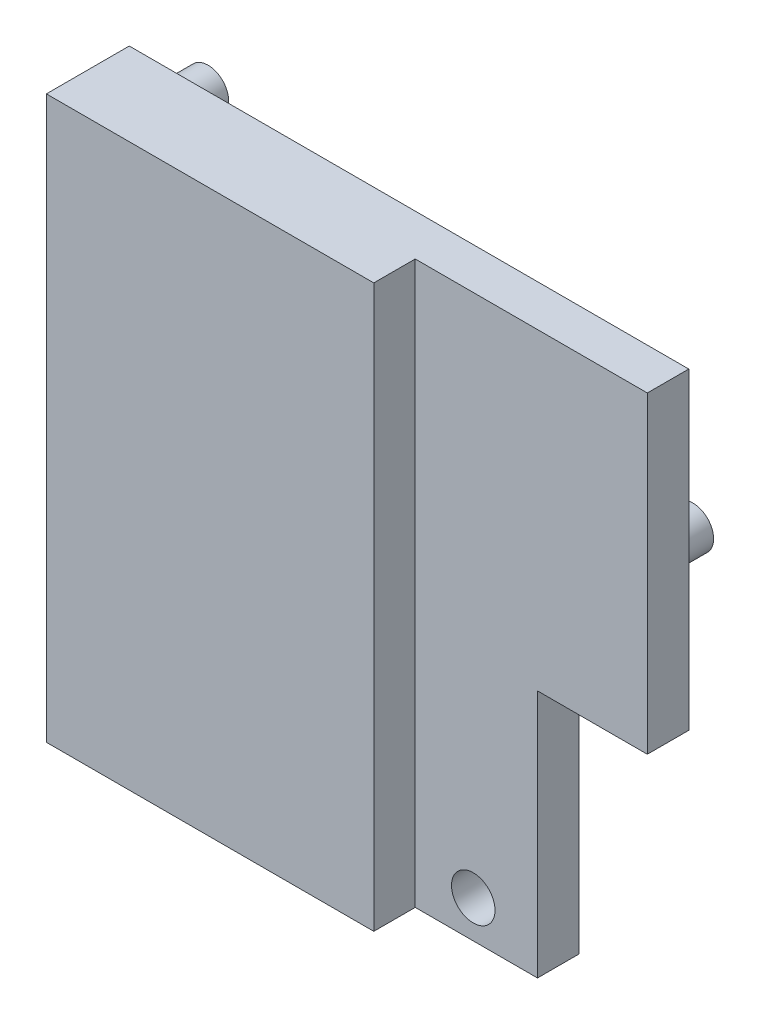
ISO-10303-21;
HEADER;
FILE_DESCRIPTION(('STEP AP214'),'2;1');
FILE_NAME('part.step','',(''),(''),'','','');
FILE_SCHEMA(('AUTOMOTIVE_DESIGN { 1 0 10303 214 1 1 1 1 }'));
ENDSEC;
DATA;
#1=APPLICATION_CONTEXT('core data for automotive mechanical design processes');
#2=APPLICATION_PROTOCOL_DEFINITION('international standard','automotive_design',2000,#1);
#3=PRODUCT_CONTEXT('',#1,'mechanical');
#4=PRODUCT('Part','Part','',(#3));
#5=PRODUCT_RELATED_PRODUCT_CATEGORY('part','',(#4));
#6=PRODUCT_DEFINITION_FORMATION('','',#4);
#7=PRODUCT_DEFINITION_CONTEXT('part definition',#1,'design');
#8=PRODUCT_DEFINITION('design','',#6,#7);
#9=PRODUCT_DEFINITION_SHAPE('','',#8);
#10=(LENGTH_UNIT() NAMED_UNIT(*) SI_UNIT(.MILLI.,.METRE.));
#11=(NAMED_UNIT(*) PLANE_ANGLE_UNIT() SI_UNIT($,.RADIAN.));
#12=(NAMED_UNIT(*) SI_UNIT($,.STERADIAN.) SOLID_ANGLE_UNIT());
#13=UNCERTAINTY_MEASURE_WITH_UNIT(LENGTH_MEASURE(1.E-05),#10,'distance_accuracy_value','');
#14=(GEOMETRIC_REPRESENTATION_CONTEXT(3) GLOBAL_UNCERTAINTY_ASSIGNED_CONTEXT((#13)) GLOBAL_UNIT_ASSIGNED_CONTEXT((#10,
#11,#12)) REPRESENTATION_CONTEXT('',''));
#15=CARTESIAN_POINT('',(0.,0.,0.));
#16=DIRECTION('',(0.,0.,1.));
#17=DIRECTION('',(1.,0.,0.));
#18=AXIS2_PLACEMENT_3D('',#15,#16,#17);
#19=CARTESIAN_POINT('',(0.,0.,2.));
#20=DIRECTION('',(0.,0.,1.));
#21=DIRECTION('',(1.,0.,0.));
#22=AXIS2_PLACEMENT_3D('',#19,#20,#21);
#23=PLANE('',#22);
#24=DIRECTION('',(1.,0.,0.));
#25=VECTOR('',#24,1.);
#26=CARTESIAN_POINT('',(0.,-30.2,2.));
#27=LINE('',#26,#25);
#28=CARTESIAN_POINT('',(42.45,-30.2,2.));
#29=VERTEX_POINT('',#28);
#30=CARTESIAN_POINT('',(53.65,-30.2,2.));
#31=VERTEX_POINT('',#30);
#32=EDGE_CURVE('E110',#29,#31,#27,.T.);
#33=ORIENTED_EDGE('',*,*,#32,.F.);
#34=DIRECTION('',(0.,1.,0.));
#35=VECTOR('',#34,1.);
#36=CARTESIAN_POINT('',(42.45,-30.,2.));
#37=LINE('',#36,#35);
#38=CARTESIAN_POINT('',(42.45,-57.3,2.));
#39=VERTEX_POINT('',#38);
#40=EDGE_CURVE('E65',#39,#29,#37,.T.);
#41=ORIENTED_EDGE('',*,*,#40,.F.);
#42=DIRECTION('',(1.,0.,0.));
#43=VECTOR('',#42,1.);
#44=CARTESIAN_POINT('',(53.65,-57.3,2.));
#45=LINE('',#44,#43);
#46=CARTESIAN_POINT('',(48.35,-57.3,2.));
#47=VERTEX_POINT('',#46);
#48=EDGE_CURVE('E132',#39,#47,#45,.T.);
#49=ORIENTED_EDGE('',*,*,#48,.T.);
#50=DIRECTION('',(0.,-1.,0.));
#51=VECTOR('',#50,1.);
#52=CARTESIAN_POINT('',(48.35,-57.3,2.));
#53=LINE('',#52,#51);
#54=CARTESIAN_POINT('',(48.35,-45.3,2.));
#55=VERTEX_POINT('',#54);
#56=EDGE_CURVE('E176',#55,#47,#53,.T.);
#57=ORIENTED_EDGE('',*,*,#56,.F.);
#58=DIRECTION('',(-1.,0.,0.));
#59=VECTOR('',#58,1.);
#60=CARTESIAN_POINT('',(53.65,-45.3,2.));
#61=LINE('',#60,#59);
#62=CARTESIAN_POINT('',(53.65,-45.3,2.));
#63=VERTEX_POINT('',#62);
#64=EDGE_CURVE('E149',#63,#55,#61,.T.);
#65=ORIENTED_EDGE('',*,*,#64,.F.);
#66=DIRECTION('',(0.,1.,0.));
#67=VECTOR('',#66,1.);
#68=CARTESIAN_POINT('',(53.65,-57.3,2.));
#69=LINE('',#68,#67);
#70=EDGE_CURVE('E137',#63,#31,#69,.T.);
#71=ORIENTED_EDGE('',*,*,#70,.T.);
#72=EDGE_LOOP('',(#33,#41,#49,#57,#65,#71));
#73=FACE_BOUND('',#72,.T.);
#74=CARTESIAN_POINT('',(45.25,-55.5,2.));
#75=DIRECTION('',(0.,0.,1.));
#76=DIRECTION('',(1.,0.,0.));
#77=AXIS2_PLACEMENT_3D('',#74,#75,#76);
#78=CIRCLE('',#77,1.05);
#79=CARTESIAN_POINT('',(46.3,-55.5,2.));
#80=VERTEX_POINT('',#79);
#81=EDGE_CURVE('E196',#80,#80,#78,.T.);
#82=ORIENTED_EDGE('',*,*,#81,.F.);
#83=EDGE_LOOP('',(#82));
#84=FACE_BOUND('',#83,.T.);
#85=ADVANCED_FACE('F42',(#73,#84),#23,.T.);
#86=CARTESIAN_POINT('',(0.,0.,0.));
#87=DIRECTION('',(0.,0.,1.));
#88=DIRECTION('',(1.,0.,0.));
#89=AXIS2_PLACEMENT_3D('',#86,#87,#88);
#90=PLANE('',#89);
#91=CARTESIAN_POINT('',(51.85,-38.7,0.));
#92=DIRECTION('',(0.,0.,1.));
#93=DIRECTION('',(1.,0.,0.));
#94=AXIS2_PLACEMENT_3D('',#91,#92,#93);
#95=CIRCLE('',#94,0.999999999999998);
#96=CARTESIAN_POINT('',(52.85,-38.7,0.));
#97=VERTEX_POINT('',#96);
#98=EDGE_CURVE('E151',#97,#97,#95,.T.);
#99=ORIENTED_EDGE('',*,*,#98,.T.);
#100=EDGE_LOOP('',(#99));
#101=FACE_BOUND('',#100,.T.);
#102=CARTESIAN_POINT('',(28.45,-32.1,0.));
#103=DIRECTION('',(0.,0.,1.));
#104=DIRECTION('',(1.,0.,0.));
#105=AXIS2_PLACEMENT_3D('',#102,#103,#104);
#106=CIRCLE('',#105,1.);
#107=CARTESIAN_POINT('',(29.45,-32.1,0.));
#108=VERTEX_POINT('',#107);
#109=EDGE_CURVE('E146',#108,#108,#106,.T.);
#110=ORIENTED_EDGE('',*,*,#109,.T.);
#111=EDGE_LOOP('',(#110));
#112=FACE_BOUND('',#111,.T.);
#113=DIRECTION('',(0.,-1.,0.));
#114=VECTOR('',#113,1.);
#115=CARTESIAN_POINT('',(26.65,-57.3,0.));
#116=LINE('',#115,#114);
#117=CARTESIAN_POINT('',(26.65,-30.2,0.));
#118=VERTEX_POINT('',#117);
#119=CARTESIAN_POINT('',(26.65,-57.3,0.));
#120=VERTEX_POINT('',#119);
#121=EDGE_CURVE('E125',#118,#120,#116,.T.);
#122=ORIENTED_EDGE('',*,*,#121,.F.);
#123=DIRECTION('',(-1.,0.,0.));
#124=VECTOR('',#123,1.);
#125=CARTESIAN_POINT('',(53.65,-30.2,0.));
#126=LINE('',#125,#124);
#127=CARTESIAN_POINT('',(53.65,-30.2,0.));
#128=VERTEX_POINT('',#127);
#129=EDGE_CURVE('E109',#128,#118,#126,.T.);
#130=ORIENTED_EDGE('',*,*,#129,.F.);
#131=DIRECTION('',(0.,1.,0.));
#132=VECTOR('',#131,1.);
#133=CARTESIAN_POINT('',(53.65,-57.3,0.));
#134=LINE('',#133,#132);
#135=CARTESIAN_POINT('',(53.65,-45.3,0.));
#136=VERTEX_POINT('',#135);
#137=EDGE_CURVE('E123',#136,#128,#134,.T.);
#138=ORIENTED_EDGE('',*,*,#137,.F.);
#139=DIRECTION('',(-1.,0.,0.));
#140=VECTOR('',#139,1.);
#141=CARTESIAN_POINT('',(53.65,-45.3,0.));
#142=LINE('',#141,#140);
#143=CARTESIAN_POINT('',(48.35,-45.3,0.));
#144=VERTEX_POINT('',#143);
#145=EDGE_CURVE('E172',#136,#144,#142,.T.);
#146=ORIENTED_EDGE('',*,*,#145,.T.);
#147=DIRECTION('',(0.,-1.,0.));
#148=VECTOR('',#147,1.);
#149=CARTESIAN_POINT('',(48.35,-57.3,0.));
#150=LINE('',#149,#148);
#151=CARTESIAN_POINT('',(48.35,-57.3,0.));
#152=VERTEX_POINT('',#151);
#153=EDGE_CURVE('E175',#144,#152,#150,.T.);
#154=ORIENTED_EDGE('',*,*,#153,.T.);
#155=DIRECTION('',(1.,0.,0.));
#156=VECTOR('',#155,1.);
#157=CARTESIAN_POINT('',(53.65,-57.3,0.));
#158=LINE('',#157,#156);
#159=EDGE_CURVE('E133',#120,#152,#158,.T.);
#160=ORIENTED_EDGE('',*,*,#159,.F.);
#161=EDGE_LOOP('',(#122,#130,#138,#146,#154,#160));
#162=FACE_BOUND('',#161,.T.);
#163=CARTESIAN_POINT('',(45.25,-55.5,0.));
#164=DIRECTION('',(0.,0.,1.));
#165=DIRECTION('',(1.,0.,0.));
#166=AXIS2_PLACEMENT_3D('',#163,#164,#165);
#167=CIRCLE('',#166,1.05);
#168=CARTESIAN_POINT('',(46.3,-55.5,0.));
#169=VERTEX_POINT('',#168);
#170=EDGE_CURVE('E190',#169,#169,#167,.T.);
#171=ORIENTED_EDGE('',*,*,#170,.T.);
#172=EDGE_LOOP('',(#171));
#173=FACE_BOUND('',#172,.T.);
#174=ADVANCED_FACE('F120',(#101,#112,#162,#173),#90,.F.);
#175=CARTESIAN_POINT('',(26.65,-57.3,2.));
#176=DIRECTION('',(1.,0.,0.));
#177=DIRECTION('',(0.,0.,-1.));
#178=AXIS2_PLACEMENT_3D('',#175,#176,#177);
#179=PLANE('',#178);
#180=DIRECTION('',(0.,-1.,0.));
#181=VECTOR('',#180,1.);
#182=CARTESIAN_POINT('',(26.65,-30.,4.));
#183=LINE('',#182,#181);
#184=CARTESIAN_POINT('',(26.65,-30.2,4.));
#185=VERTEX_POINT('',#184);
#186=CARTESIAN_POINT('',(26.65,-57.3,4.));
#187=VERTEX_POINT('',#186);
#188=EDGE_CURVE('E218',#185,#187,#183,.T.);
#189=ORIENTED_EDGE('',*,*,#188,.F.);
#190=DIRECTION('',(0.,0.,-1.));
#191=VECTOR('',#190,1.);
#192=CARTESIAN_POINT('',(26.65,-30.2,4.));
#193=LINE('',#192,#191);
#194=EDGE_CURVE('E57',#185,#118,#193,.T.);
#195=ORIENTED_EDGE('',*,*,#194,.T.);
#196=ORIENTED_EDGE('',*,*,#121,.T.);
#197=DIRECTION('',(0.,0.,-1.));
#198=VECTOR('',#197,1.);
#199=CARTESIAN_POINT('',(26.65,-57.3,2.));
#200=LINE('',#199,#198);
#201=EDGE_CURVE('E51',#187,#120,#200,.T.);
#202=ORIENTED_EDGE('',*,*,#201,.F.);
#203=EDGE_LOOP('',(#189,#195,#196,#202));
#204=FACE_BOUND('',#203,.T.);
#205=ADVANCED_FACE('F44',(#204),#179,.F.);
#206=CARTESIAN_POINT('',(53.65,-57.3,2.));
#207=DIRECTION('',(0.,1.,0.));
#208=DIRECTION('',(0.,0.,1.));
#209=AXIS2_PLACEMENT_3D('',#206,#207,#208);
#210=PLANE('',#209);
#211=ORIENTED_EDGE('',*,*,#159,.T.);
#212=DIRECTION('',(0.,0.,1.));
#213=VECTOR('',#212,1.);
#214=CARTESIAN_POINT('',(48.35,-57.3,0.));
#215=LINE('',#214,#213);
#216=EDGE_CURVE('E186',#152,#47,#215,.T.);
#217=ORIENTED_EDGE('',*,*,#216,.T.);
#218=ORIENTED_EDGE('',*,*,#48,.F.);
#219=DIRECTION('',(0.,0.,-1.));
#220=VECTOR('',#219,1.);
#221=CARTESIAN_POINT('',(42.45,-57.3,4.));
#222=LINE('',#221,#220);
#223=CARTESIAN_POINT('',(42.45,-57.3,4.));
#224=VERTEX_POINT('',#223);
#225=EDGE_CURVE('E162',#224,#39,#222,.T.);
#226=ORIENTED_EDGE('',*,*,#225,.F.);
#227=DIRECTION('',(1.,0.,0.));
#228=VECTOR('',#227,1.);
#229=CARTESIAN_POINT('',(26.65,-57.3,4.));
#230=LINE('',#229,#228);
#231=EDGE_CURVE('E213',#187,#224,#230,.T.);
#232=ORIENTED_EDGE('',*,*,#231,.F.);
#233=ORIENTED_EDGE('',*,*,#201,.T.);
#234=EDGE_LOOP('',(#211,#217,#218,#226,#232,#233));
#235=FACE_BOUND('',#234,.T.);
#236=ADVANCED_FACE('F211',(#235),#210,.F.);
#237=CARTESIAN_POINT('',(53.65,-57.3,2.));
#238=DIRECTION('',(-1.,0.,0.));
#239=DIRECTION('',(0.,0.,1.));
#240=AXIS2_PLACEMENT_3D('',#237,#238,#239);
#241=PLANE('',#240);
#242=ORIENTED_EDGE('',*,*,#137,.T.);
#243=DIRECTION('',(0.,0.,-1.));
#244=VECTOR('',#243,1.);
#245=CARTESIAN_POINT('',(53.65,-30.2,4.));
#246=LINE('',#245,#244);
#247=EDGE_CURVE('E106',#31,#128,#246,.T.);
#248=ORIENTED_EDGE('',*,*,#247,.F.);
#249=ORIENTED_EDGE('',*,*,#70,.F.);
#250=DIRECTION('',(0.,0.,1.));
#251=VECTOR('',#250,1.);
#252=CARTESIAN_POINT('',(53.65,-45.3,0.));
#253=LINE('',#252,#251);
#254=EDGE_CURVE('E130',#136,#63,#253,.T.);
#255=ORIENTED_EDGE('',*,*,#254,.F.);
#256=EDGE_LOOP('',(#242,#248,#249,#255));
#257=FACE_BOUND('',#256,.T.);
#258=ADVANCED_FACE('F129',(#257),#241,.F.);
#259=CARTESIAN_POINT('',(45.25,-55.5,2.));
#260=DIRECTION('',(0.,0.,-1.));
#261=DIRECTION('',(-1.,0.,0.));
#262=AXIS2_PLACEMENT_3D('',#259,#260,#261);
#263=CYLINDRICAL_SURFACE('',#262,1.05);
#264=ORIENTED_EDGE('',*,*,#81,.T.);
#265=EDGE_LOOP('',(#264));
#266=FACE_BOUND('',#265,.T.);
#267=ORIENTED_EDGE('',*,*,#170,.F.);
#268=EDGE_LOOP('',(#267));
#269=FACE_BOUND('',#268,.T.);
#270=ADVANCED_FACE('F252',(#266,#269),#263,.F.);
#271=CARTESIAN_POINT('',(48.35,-57.3,0.));
#272=DIRECTION('',(-1.,0.,0.));
#273=DIRECTION('',(0.,0.,1.));
#274=AXIS2_PLACEMENT_3D('',#271,#272,#273);
#275=PLANE('',#274);
#276=ORIENTED_EDGE('',*,*,#56,.T.);
#277=ORIENTED_EDGE('',*,*,#216,.F.);
#278=ORIENTED_EDGE('',*,*,#153,.F.);
#279=DIRECTION('',(0.,0.,1.));
#280=VECTOR('',#279,1.);
#281=CARTESIAN_POINT('',(48.35,-45.3,0.));
#282=LINE('',#281,#280);
#283=EDGE_CURVE('E191',#144,#55,#282,.T.);
#284=ORIENTED_EDGE('',*,*,#283,.T.);
#285=EDGE_LOOP('',(#276,#277,#278,#284));
#286=FACE_BOUND('',#285,.T.);
#287=ADVANCED_FACE('F332',(#286),#275,.F.);
#288=CARTESIAN_POINT('',(53.65,-45.3,0.));
#289=DIRECTION('',(0.,1.,0.));
#290=DIRECTION('',(0.,0.,1.));
#291=AXIS2_PLACEMENT_3D('',#288,#289,#290);
#292=PLANE('',#291);
#293=ORIENTED_EDGE('',*,*,#64,.T.);
#294=ORIENTED_EDGE('',*,*,#283,.F.);
#295=ORIENTED_EDGE('',*,*,#145,.F.);
#296=ORIENTED_EDGE('',*,*,#254,.T.);
#297=EDGE_LOOP('',(#293,#294,#295,#296));
#298=FACE_BOUND('',#297,.T.);
#299=ADVANCED_FACE('F321',(#298),#292,.F.);
#300=CARTESIAN_POINT('',(28.45,-32.1,-2.));
#301=DIRECTION('',(0.,0.,1.));
#302=DIRECTION('',(1.,0.,0.));
#303=AXIS2_PLACEMENT_3D('',#300,#301,#302);
#304=CYLINDRICAL_SURFACE('',#303,1.);
#305=CARTESIAN_POINT('',(28.45,-32.1,-2.));
#306=DIRECTION('',(0.,0.,1.));
#307=DIRECTION('',(1.,0.,0.));
#308=AXIS2_PLACEMENT_3D('',#305,#306,#307);
#309=CIRCLE('',#308,1.);
#310=CARTESIAN_POINT('',(29.45,-32.1,-2.));
#311=VERTEX_POINT('',#310);
#312=EDGE_CURVE('E150',#311,#311,#309,.T.);
#313=ORIENTED_EDGE('',*,*,#312,.T.);
#314=EDGE_LOOP('',(#313));
#315=FACE_BOUND('',#314,.T.);
#316=ORIENTED_EDGE('',*,*,#109,.F.);
#317=EDGE_LOOP('',(#316));
#318=FACE_BOUND('',#317,.T.);
#319=ADVANCED_FACE('F310',(#315,#318),#304,.T.);
#320=CARTESIAN_POINT('',(28.45,-32.1,-2.));
#321=DIRECTION('',(0.,0.,1.));
#322=DIRECTION('',(1.,0.,0.));
#323=AXIS2_PLACEMENT_3D('',#320,#321,#322);
#324=PLANE('',#323);
#325=ORIENTED_EDGE('',*,*,#312,.F.);
#326=EDGE_LOOP('',(#325));
#327=FACE_BOUND('',#326,.T.);
#328=ADVANCED_FACE('F300',(#327),#324,.F.);
#329=CARTESIAN_POINT('',(51.85,-38.7,-2.));
#330=DIRECTION('',(0.,0.,1.));
#331=DIRECTION('',(1.,0.,0.));
#332=AXIS2_PLACEMENT_3D('',#329,#330,#331);
#333=CYLINDRICAL_SURFACE('',#332,0.999999999999998);
#334=CARTESIAN_POINT('',(51.85,-38.7,-2.));
#335=DIRECTION('',(0.,0.,1.));
#336=DIRECTION('',(1.,0.,0.));
#337=AXIS2_PLACEMENT_3D('',#334,#335,#336);
#338=CIRCLE('',#337,0.999999999999998);
#339=CARTESIAN_POINT('',(52.85,-38.7,-2.));
#340=VERTEX_POINT('',#339);
#341=EDGE_CURVE('E154',#340,#340,#338,.T.);
#342=ORIENTED_EDGE('',*,*,#341,.T.);
#343=EDGE_LOOP('',(#342));
#344=FACE_BOUND('',#343,.T.);
#345=ORIENTED_EDGE('',*,*,#98,.F.);
#346=EDGE_LOOP('',(#345));
#347=FACE_BOUND('',#346,.T.);
#348=ADVANCED_FACE('F289',(#344,#347),#333,.T.);
#349=CARTESIAN_POINT('',(51.85,-38.7,-2.));
#350=DIRECTION('',(0.,0.,1.));
#351=DIRECTION('',(1.,0.,0.));
#352=AXIS2_PLACEMENT_3D('',#349,#350,#351);
#353=PLANE('',#352);
#354=ORIENTED_EDGE('',*,*,#341,.F.);
#355=EDGE_LOOP('',(#354));
#356=FACE_BOUND('',#355,.T.);
#357=ADVANCED_FACE('F243',(#356),#353,.F.);
#358=CARTESIAN_POINT('',(42.45,-30.,4.));
#359=DIRECTION('',(-1.,0.,0.));
#360=DIRECTION('',(0.,-1.,0.));
#361=AXIS2_PLACEMENT_3D('',#358,#359,#360);
#362=PLANE('',#361);
#363=ORIENTED_EDGE('',*,*,#40,.T.);
#364=DIRECTION('',(0.,0.,1.));
#365=VECTOR('',#364,1.);
#366=CARTESIAN_POINT('',(42.45,-30.2,4.));
#367=LINE('',#366,#365);
#368=CARTESIAN_POINT('',(42.45,-30.2,4.));
#369=VERTEX_POINT('',#368);
#370=EDGE_CURVE('E229',#29,#369,#367,.T.);
#371=ORIENTED_EDGE('',*,*,#370,.T.);
#372=DIRECTION('',(0.,1.,0.));
#373=VECTOR('',#372,1.);
#374=CARTESIAN_POINT('',(42.45,-30.,4.));
#375=LINE('',#374,#373);
#376=EDGE_CURVE('E168',#224,#369,#375,.T.);
#377=ORIENTED_EDGE('',*,*,#376,.F.);
#378=ORIENTED_EDGE('',*,*,#225,.T.);
#379=EDGE_LOOP('',(#363,#371,#377,#378));
#380=FACE_BOUND('',#379,.T.);
#381=ADVANCED_FACE('F234',(#380),#362,.F.);
#382=CARTESIAN_POINT('',(0.,0.,4.));
#383=DIRECTION('',(0.,0.,1.));
#384=DIRECTION('',(1.,0.,0.));
#385=AXIS2_PLACEMENT_3D('',#382,#383,#384);
#386=PLANE('',#385);
#387=DIRECTION('',(1.,0.,0.));
#388=VECTOR('',#387,1.);
#389=CARTESIAN_POINT('',(0.,-30.2,4.));
#390=LINE('',#389,#388);
#391=EDGE_CURVE('E11',#185,#369,#390,.T.);
#392=ORIENTED_EDGE('',*,*,#391,.F.);
#393=ORIENTED_EDGE('',*,*,#188,.T.);
#394=ORIENTED_EDGE('',*,*,#231,.T.);
#395=ORIENTED_EDGE('',*,*,#376,.T.);
#396=EDGE_LOOP('',(#392,#393,#394,#395));
#397=FACE_BOUND('',#396,.T.);
#398=ADVANCED_FACE('F235',(#397),#386,.T.);
#399=CARTESIAN_POINT('',(53.65,-30.2,4.));
#400=DIRECTION('',(0.,-1.,0.));
#401=DIRECTION('',(0.,0.,-1.));
#402=AXIS2_PLACEMENT_3D('',#399,#400,#401);
#403=PLANE('',#402);
#404=ORIENTED_EDGE('',*,*,#32,.T.);
#405=ORIENTED_EDGE('',*,*,#247,.T.);
#406=ORIENTED_EDGE('',*,*,#129,.T.);
#407=ORIENTED_EDGE('',*,*,#194,.F.);
#408=ORIENTED_EDGE('',*,*,#391,.T.);
#409=ORIENTED_EDGE('',*,*,#370,.F.);
#410=EDGE_LOOP('',(#404,#405,#406,#407,#408,#409));
#411=FACE_BOUND('',#410,.T.);
#412=ADVANCED_FACE('F108',(#411),#403,.F.);
#413=CLOSED_SHELL('',(#85,#174,#205,#236,#258,#270,#287,#299,#319,#328,#348,#357,#381,#398,#412));
#414=MANIFOLD_SOLID_BREP('B2',#413);
#415=ADVANCED_BREP_SHAPE_REPRESENTATION('',(#18,#414),#14);
#416=SHAPE_DEFINITION_REPRESENTATION(#9,#415);
ENDSEC;
END-ISO-10303-21;
